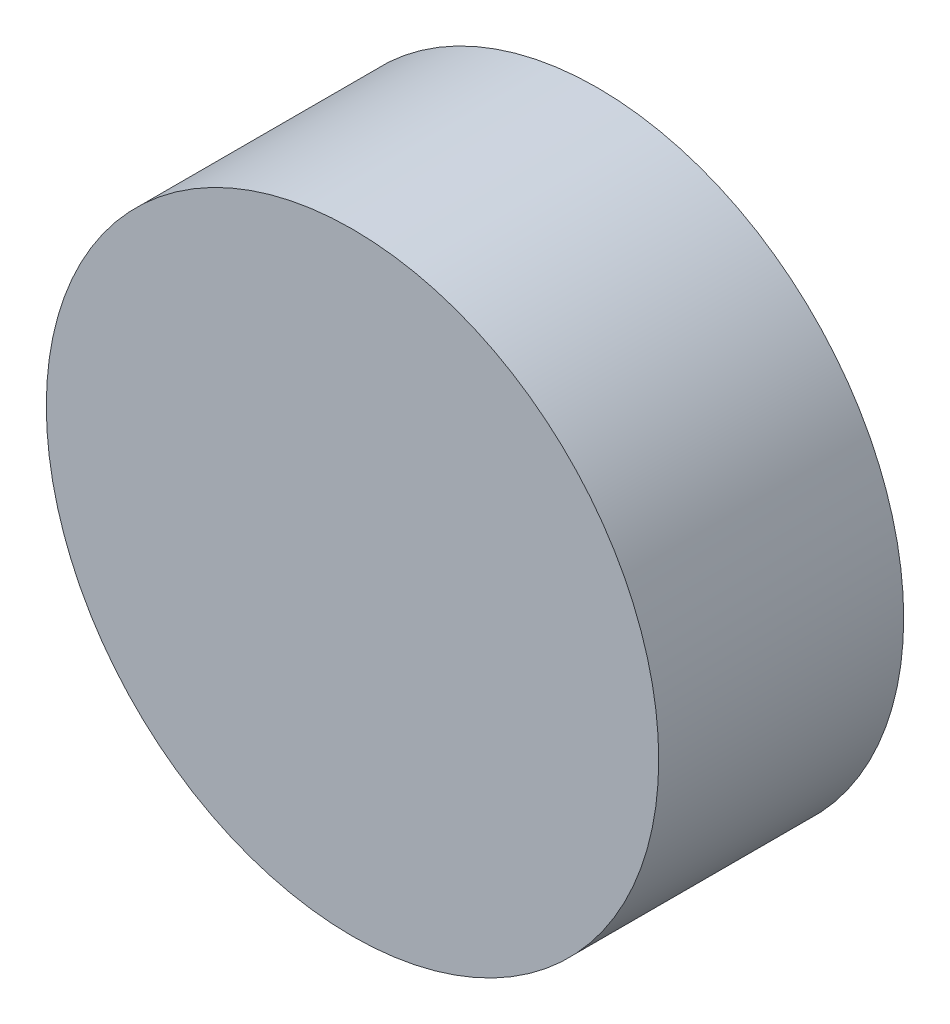
ISO-10303-21;
HEADER;
FILE_DESCRIPTION(('STEP AP214'),'2;1');
FILE_NAME('part.step','',(''),(''),'','','');
FILE_SCHEMA(('AUTOMOTIVE_DESIGN { 1 0 10303 214 1 1 1 1 }'));
ENDSEC;
DATA;
#1=APPLICATION_CONTEXT('core data for automotive mechanical design processes');
#2=APPLICATION_PROTOCOL_DEFINITION('international standard','automotive_design',2000,#1);
#3=PRODUCT_CONTEXT('',#1,'mechanical');
#4=PRODUCT('Part','Part','',(#3));
#5=PRODUCT_RELATED_PRODUCT_CATEGORY('part','',(#4));
#6=PRODUCT_DEFINITION_FORMATION('','',#4);
#7=PRODUCT_DEFINITION_CONTEXT('part definition',#1,'design');
#8=PRODUCT_DEFINITION('design','',#6,#7);
#9=PRODUCT_DEFINITION_SHAPE('','',#8);
#10=(LENGTH_UNIT() NAMED_UNIT(*) SI_UNIT(.MILLI.,.METRE.));
#11=(NAMED_UNIT(*) PLANE_ANGLE_UNIT() SI_UNIT($,.RADIAN.));
#12=(NAMED_UNIT(*) SI_UNIT($,.STERADIAN.) SOLID_ANGLE_UNIT());
#13=UNCERTAINTY_MEASURE_WITH_UNIT(LENGTH_MEASURE(1.E-05),#10,'distance_accuracy_value','');
#14=(GEOMETRIC_REPRESENTATION_CONTEXT(3) GLOBAL_UNCERTAINTY_ASSIGNED_CONTEXT((#13)) GLOBAL_UNIT_ASSIGNED_CONTEXT((#10,
#11,#12)) REPRESENTATION_CONTEXT('',''));
#15=CARTESIAN_POINT('',(0.,0.,0.));
#16=DIRECTION('',(0.,0.,1.));
#17=DIRECTION('',(1.,0.,0.));
#18=AXIS2_PLACEMENT_3D('',#15,#16,#17);
#19=CARTESIAN_POINT('',(0.,0.,4.));
#20=DIRECTION('',(0.,0.,-1.));
#21=DIRECTION('',(-1.,0.,0.));
#22=AXIS2_PLACEMENT_3D('',#19,#20,#21);
#23=CYLINDRICAL_SURFACE('',#22,5.);
#24=CARTESIAN_POINT('',(0.,0.,4.));
#25=DIRECTION('',(0.,0.,1.));
#26=DIRECTION('',(1.,0.,0.));
#27=AXIS2_PLACEMENT_3D('',#24,#25,#26);
#28=CIRCLE('',#27,5.);
#29=CARTESIAN_POINT('',(5.,0.,4.));
#30=VERTEX_POINT('',#29);
#31=EDGE_CURVE('E10',#30,#30,#28,.T.);
#32=ORIENTED_EDGE('',*,*,#31,.F.);
#33=EDGE_LOOP('',(#32));
#34=FACE_BOUND('',#33,.T.);
#35=CARTESIAN_POINT('',(0.,0.,0.));
#36=DIRECTION('',(0.,0.,1.));
#37=DIRECTION('',(1.,0.,0.));
#38=AXIS2_PLACEMENT_3D('',#35,#36,#37);
#39=CIRCLE('',#38,5.);
#40=CARTESIAN_POINT('',(5.,0.,0.));
#41=VERTEX_POINT('',#40);
#42=EDGE_CURVE('E37',#41,#41,#39,.T.);
#43=ORIENTED_EDGE('',*,*,#42,.T.);
#44=EDGE_LOOP('',(#43));
#45=FACE_BOUND('',#44,.T.);
#46=ADVANCED_FACE('F34',(#34,#45),#23,.T.);
#47=CARTESIAN_POINT('',(0.,0.,4.));
#48=DIRECTION('',(0.,0.,1.));
#49=DIRECTION('',(1.,0.,0.));
#50=AXIS2_PLACEMENT_3D('',#47,#48,#49);
#51=PLANE('',#50);
#52=ORIENTED_EDGE('',*,*,#31,.T.);
#53=EDGE_LOOP('',(#52));
#54=FACE_BOUND('',#53,.T.);
#55=ADVANCED_FACE('F49',(#54),#51,.T.);
#56=CARTESIAN_POINT('',(0.,0.,0.));
#57=DIRECTION('',(0.,0.,1.));
#58=DIRECTION('',(1.,0.,0.));
#59=AXIS2_PLACEMENT_3D('',#56,#57,#58);
#60=PLANE('',#59);
#61=ORIENTED_EDGE('',*,*,#42,.F.);
#62=EDGE_LOOP('',(#61));
#63=FACE_BOUND('',#62,.T.);
#64=ADVANCED_FACE('F47',(#63),#60,.F.);
#65=CLOSED_SHELL('',(#46,#55,#64));
#66=MANIFOLD_SOLID_BREP('B2',#65);
#67=ADVANCED_BREP_SHAPE_REPRESENTATION('',(#18,#66),#14);
#68=SHAPE_DEFINITION_REPRESENTATION(#9,#67);
ENDSEC;
END-ISO-10303-21;
